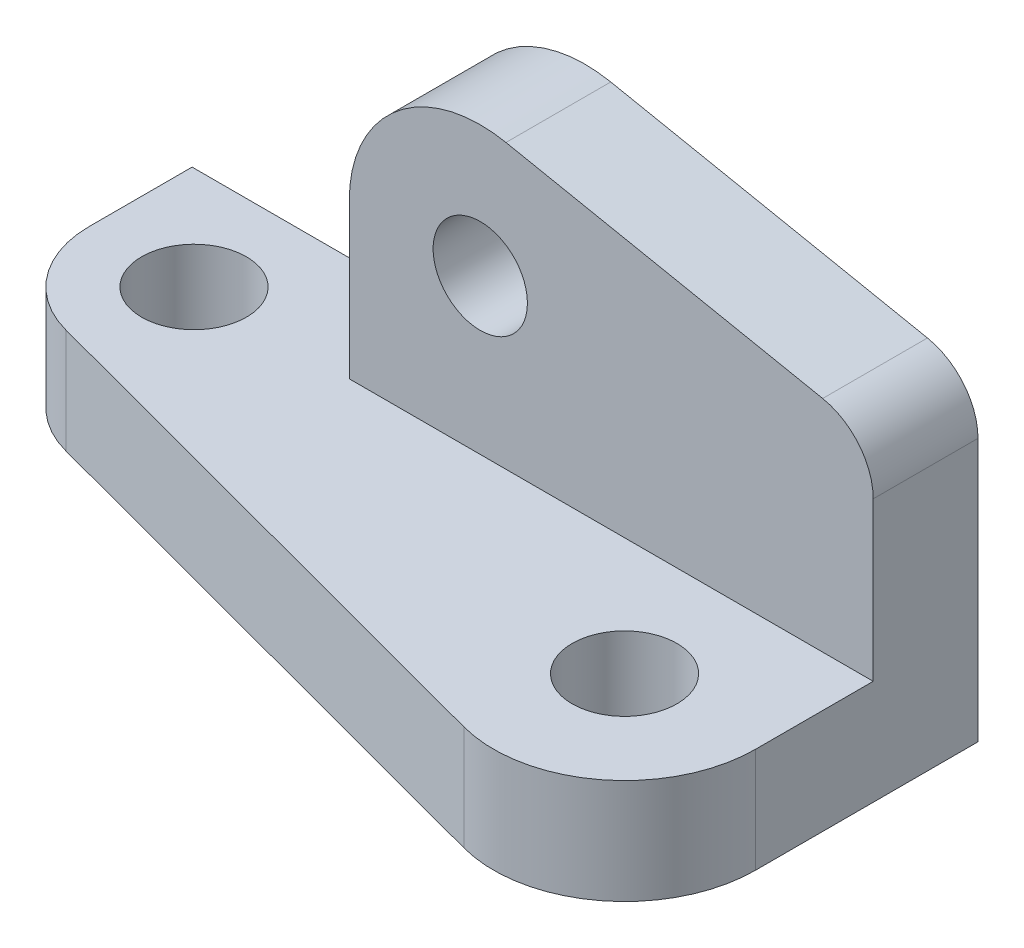
ISO-10303-21;
HEADER;
FILE_DESCRIPTION(('STEP AP214'),'2;1');
FILE_NAME('part.step','',(''),(''),'','','');
FILE_SCHEMA(('AUTOMOTIVE_DESIGN { 1 0 10303 214 1 1 1 1 }'));
ENDSEC;
DATA;
#1=APPLICATION_CONTEXT('core data for automotive mechanical design processes');
#2=APPLICATION_PROTOCOL_DEFINITION('international standard','automotive_design',2000,#1);
#3=PRODUCT_CONTEXT('',#1,'mechanical');
#4=PRODUCT('Part','Part','',(#3));
#5=PRODUCT_RELATED_PRODUCT_CATEGORY('part','',(#4));
#6=PRODUCT_DEFINITION_FORMATION('','',#4);
#7=PRODUCT_DEFINITION_CONTEXT('part definition',#1,'design');
#8=PRODUCT_DEFINITION('design','',#6,#7);
#9=PRODUCT_DEFINITION_SHAPE('','',#8);
#10=(LENGTH_UNIT() NAMED_UNIT(*) SI_UNIT(.MILLI.,.METRE.));
#11=(NAMED_UNIT(*) PLANE_ANGLE_UNIT() SI_UNIT($,.RADIAN.));
#12=(NAMED_UNIT(*) SI_UNIT($,.STERADIAN.) SOLID_ANGLE_UNIT());
#13=UNCERTAINTY_MEASURE_WITH_UNIT(LENGTH_MEASURE(1.E-05),#10,'distance_accuracy_value','');
#14=(GEOMETRIC_REPRESENTATION_CONTEXT(3) GLOBAL_UNCERTAINTY_ASSIGNED_CONTEXT((#13)) GLOBAL_UNIT_ASSIGNED_CONTEXT((#10,
#11,#12)) REPRESENTATION_CONTEXT('',''));
#15=CARTESIAN_POINT('',(0.,0.,0.));
#16=DIRECTION('',(0.,0.,1.));
#17=DIRECTION('',(1.,0.,0.));
#18=AXIS2_PLACEMENT_3D('',#15,#16,#17);
#19=CARTESIAN_POINT('',(150.,20.,40.));
#20=DIRECTION('',(0.257662650560332,0.,-0.966234939601246));
#21=DIRECTION('',(-0.966234939601246,0.,-0.257662650560332));
#22=AXIS2_PLACEMENT_3D('',#19,#20,#21);
#23=PLANE('',#22);
#24=DIRECTION('',(0.966234939601246,0.,0.257662650560332));
#25=VECTOR('',#24,1.);
#26=CARTESIAN_POINT('',(150.,0.,40.));
#27=LINE('',#26,#25);
#28=CARTESIAN_POINT('',(14.8467469887934,0.,3.9591325303449));
#29=VERTEX_POINT('',#28);
#30=CARTESIAN_POINT('',(118.558433735992,0.,31.6155823295978));
#31=VERTEX_POINT('',#30);
#32=EDGE_CURVE('E136',#29,#31,#27,.T.);
#33=ORIENTED_EDGE('',*,*,#32,.T.);
#34=DIRECTION('',(0.,-1.,0.));
#35=VECTOR('',#34,1.);
#36=CARTESIAN_POINT('',(118.558433735992,20.,31.6155823295978));
#37=LINE('',#36,#35);
#38=CARTESIAN_POINT('',(118.558433735992,20.,31.6155823295978));
#39=VERTEX_POINT('',#38);
#40=EDGE_CURVE('E186',#31,#39,#37,.F.);
#41=ORIENTED_EDGE('',*,*,#40,.T.);
#42=DIRECTION('',(0.966234939601246,0.,0.257662650560332));
#43=VECTOR('',#42,1.);
#44=CARTESIAN_POINT('',(150.,20.,40.));
#45=LINE('',#44,#43);
#46=CARTESIAN_POINT('',(14.8467469887934,20.,3.9591325303449));
#47=VERTEX_POINT('',#46);
#48=EDGE_CURVE('E155',#47,#39,#45,.T.);
#49=ORIENTED_EDGE('',*,*,#48,.F.);
#50=DIRECTION('',(0.,-1.,0.));
#51=VECTOR('',#50,1.);
#52=CARTESIAN_POINT('',(14.8467469887933,20.,3.95913253034489));
#53=LINE('',#52,#51);
#54=EDGE_CURVE('E172',#47,#29,#53,.T.);
#55=ORIENTED_EDGE('',*,*,#54,.T.);
#56=EDGE_LOOP('',(#33,#41,#49,#55));
#57=FACE_BOUND('',#56,.T.);
#58=ADVANCED_FACE('F33',(#57),#23,.F.);
#59=CARTESIAN_POINT('',(150.,20.,-35.));
#60=DIRECTION('',(-1.,0.,0.));
#61=DIRECTION('',(0.,0.,1.));
#62=AXIS2_PLACEMENT_3D('',#59,#60,#61);
#63=PLANE('',#62);
#64=DIRECTION('',(0.,-1.,0.));
#65=VECTOR('',#64,1.);
#66=CARTESIAN_POINT('',(150.,20.,-35.));
#67=LINE('',#66,#65);
#68=CARTESIAN_POINT('',(150.,50.1623531673773,-35.));
#69=VERTEX_POINT('',#68);
#70=CARTESIAN_POINT('',(150.,0.,-35.));
#71=VERTEX_POINT('',#70);
#72=EDGE_CURVE('E170',#69,#71,#67,.T.);
#73=ORIENTED_EDGE('',*,*,#72,.F.);
#74=DIRECTION('',(0.,0.,-1.));
#75=VECTOR('',#74,1.);
#76=CARTESIAN_POINT('',(150.,50.1623531673773,-15.));
#77=LINE('',#76,#75);
#78=CARTESIAN_POINT('',(150.,50.1623531673773,-15.));
#79=VERTEX_POINT('',#78);
#80=EDGE_CURVE('E41',#69,#79,#77,.F.);
#81=ORIENTED_EDGE('',*,*,#80,.T.);
#82=DIRECTION('',(0.,-1.,0.));
#83=VECTOR('',#82,1.);
#84=CARTESIAN_POINT('',(150.,0.,-15.));
#85=LINE('',#84,#83);
#86=CARTESIAN_POINT('',(150.,20.,-15.));
#87=VERTEX_POINT('',#86);
#88=EDGE_CURVE('E151',#79,#87,#85,.T.);
#89=ORIENTED_EDGE('',*,*,#88,.T.);
#90=DIRECTION('',(0.,0.,-1.));
#91=VECTOR('',#90,1.);
#92=CARTESIAN_POINT('',(150.,20.,-35.));
#93=LINE('',#92,#91);
#94=CARTESIAN_POINT('',(150.,20.,7.45970883956661));
#95=VERTEX_POINT('',#94);
#96=EDGE_CURVE('E124',#95,#87,#93,.T.);
#97=ORIENTED_EDGE('',*,*,#96,.F.);
#98=DIRECTION('',(0.,-1.,0.));
#99=VECTOR('',#98,1.);
#100=CARTESIAN_POINT('',(150.,20.,7.45970883956661));
#101=LINE('',#100,#99);
#102=CARTESIAN_POINT('',(150.,0.,7.45970883956661));
#103=VERTEX_POINT('',#102);
#104=EDGE_CURVE('E181',#95,#103,#101,.T.);
#105=ORIENTED_EDGE('',*,*,#104,.T.);
#106=DIRECTION('',(0.,0.,-1.));
#107=VECTOR('',#106,1.);
#108=CARTESIAN_POINT('',(150.,0.,-35.));
#109=LINE('',#108,#107);
#110=EDGE_CURVE('E162',#103,#71,#109,.T.);
#111=ORIENTED_EDGE('',*,*,#110,.T.);
#112=EDGE_LOOP('',(#73,#81,#89,#97,#105,#111));
#113=FACE_BOUND('',#112,.T.);
#114=ADVANCED_FACE('F246',(#113),#63,.F.);
#115=CARTESIAN_POINT('',(0.,20.,-35.));
#116=DIRECTION('',(0.,0.,1.));
#117=DIRECTION('',(1.,0.,0.));
#118=AXIS2_PLACEMENT_3D('',#115,#116,#117);
#119=PLANE('',#118);
#120=CARTESIAN_POINT('',(75.,49.5049024320361,-35.));
#121=DIRECTION('',(0.,0.,1.));
#122=DIRECTION('',(1.,0.,0.));
#123=AXIS2_PLACEMENT_3D('',#120,#121,#122);
#124=CIRCLE('',#123,8.99999999999999);
#125=CARTESIAN_POINT('',(84.,49.5049024320361,-35.));
#126=VERTEX_POINT('',#125);
#127=EDGE_CURVE('E225',#126,#126,#124,.T.);
#128=ORIENTED_EDGE('',*,*,#127,.T.);
#129=EDGE_LOOP('',(#128));
#130=FACE_BOUND('',#129,.T.);
#131=DIRECTION('',(0.98058067569092,-0.196116135138184,0.));
#132=VECTOR('',#131,1.);
#133=CARTESIAN_POINT('',(150.,60.,-35.));
#134=LINE('',#133,#132);
#135=CARTESIAN_POINT('',(79.9029033784546,74.0194193243091,-35.));
#136=VERTEX_POINT('',#135);
#137=CARTESIAN_POINT('',(140.353393621658,61.9293212756684,-35.));
#138=VERTEX_POINT('',#137);
#139=EDGE_CURVE('E142',#136,#138,#134,.T.);
#140=ORIENTED_EDGE('',*,*,#139,.T.);
#141=CARTESIAN_POINT('',(138.,50.1623531673773,-35.));
#142=DIRECTION('',(0.,0.,1.));
#143=DIRECTION('',(1.,0.,0.));
#144=AXIS2_PLACEMENT_3D('',#141,#142,#143);
#145=CIRCLE('',#144,12.);
#146=EDGE_CURVE('E55',#138,#69,#145,.F.);
#147=ORIENTED_EDGE('',*,*,#146,.T.);
#148=ORIENTED_EDGE('',*,*,#72,.T.);
#149=DIRECTION('',(-1.,0.,0.));
#150=VECTOR('',#149,1.);
#151=CARTESIAN_POINT('',(0.,0.,-35.));
#152=LINE('',#151,#150);
#153=CARTESIAN_POINT('',(0.,0.,-35.));
#154=VERTEX_POINT('',#153);
#155=EDGE_CURVE('E165',#71,#154,#152,.T.);
#156=ORIENTED_EDGE('',*,*,#155,.T.);
#157=DIRECTION('',(0.,-1.,0.));
#158=VECTOR('',#157,1.);
#159=CARTESIAN_POINT('',(0.,20.,-35.));
#160=LINE('',#159,#158);
#161=CARTESIAN_POINT('',(0.,20.,-35.));
#162=VERTEX_POINT('',#161);
#163=EDGE_CURVE('E119',#162,#154,#160,.T.);
#164=ORIENTED_EDGE('',*,*,#163,.F.);
#165=DIRECTION('',(-1.,0.,0.));
#166=VECTOR('',#165,1.);
#167=CARTESIAN_POINT('',(0.,20.,-35.));
#168=LINE('',#167,#166);
#169=CARTESIAN_POINT('',(50.,20.,-35.));
#170=VERTEX_POINT('',#169);
#171=EDGE_CURVE('E113',#170,#162,#168,.T.);
#172=ORIENTED_EDGE('',*,*,#171,.F.);
#173=DIRECTION('',(0.,1.,0.));
#174=VECTOR('',#173,1.);
#175=CARTESIAN_POINT('',(50.,80.,-35.));
#176=LINE('',#175,#174);
#177=CARTESIAN_POINT('',(50.,49.5049024320361,-35.));
#178=VERTEX_POINT('',#177);
#179=EDGE_CURVE('E117',#170,#178,#176,.T.);
#180=ORIENTED_EDGE('',*,*,#179,.T.);
#181=CARTESIAN_POINT('',(75.,49.5049024320361,-35.));
#182=DIRECTION('',(0.,0.,1.));
#183=DIRECTION('',(1.,0.,0.));
#184=AXIS2_PLACEMENT_3D('',#181,#182,#183);
#185=CIRCLE('',#184,25.);
#186=EDGE_CURVE('E191',#178,#136,#185,.F.);
#187=ORIENTED_EDGE('',*,*,#186,.T.);
#188=EDGE_LOOP('',(#140,#147,#148,#156,#164,#172,#180,#187));
#189=FACE_BOUND('',#188,.T.);
#190=ADVANCED_FACE('F115',(#130,#189),#119,.F.);
#191=CARTESIAN_POINT('',(0.,20.,0.));
#192=DIRECTION('',(1.,0.,0.));
#193=DIRECTION('',(0.,0.,-1.));
#194=AXIS2_PLACEMENT_3D('',#191,#192,#193);
#195=PLANE('',#194);
#196=DIRECTION('',(0.,0.,1.));
#197=VECTOR('',#196,1.);
#198=CARTESIAN_POINT('',(0.,0.,0.));
#199=LINE('',#198,#197);
#200=CARTESIAN_POINT('',(0.,0.,-15.36556626168));
#201=VERTEX_POINT('',#200);
#202=EDGE_CURVE('E157',#154,#201,#199,.T.);
#203=ORIENTED_EDGE('',*,*,#202,.T.);
#204=DIRECTION('',(0.,-1.,0.));
#205=VECTOR('',#204,1.);
#206=CARTESIAN_POINT('',(0.,20.,-15.36556626168));
#207=LINE('',#206,#205);
#208=CARTESIAN_POINT('',(0.,20.,-15.36556626168));
#209=VERTEX_POINT('',#208);
#210=EDGE_CURVE('E177',#201,#209,#207,.F.);
#211=ORIENTED_EDGE('',*,*,#210,.T.);
#212=DIRECTION('',(0.,0.,1.));
#213=VECTOR('',#212,1.);
#214=CARTESIAN_POINT('',(0.,20.,0.));
#215=LINE('',#214,#213);
#216=EDGE_CURVE('E123',#162,#209,#215,.T.);
#217=ORIENTED_EDGE('',*,*,#216,.F.);
#218=ORIENTED_EDGE('',*,*,#163,.T.);
#219=EDGE_LOOP('',(#203,#211,#217,#218));
#220=FACE_BOUND('',#219,.T.);
#221=ADVANCED_FACE('F286',(#220),#195,.F.);
#222=CARTESIAN_POINT('',(0.,20.,0.));
#223=DIRECTION('',(0.,-1.,0.));
#224=DIRECTION('',(0.,0.,-1.));
#225=AXIS2_PLACEMENT_3D('',#222,#223,#224);
#226=PLANE('',#225);
#227=CARTESIAN_POINT('',(20.,20.,-15.36556626168));
#228=DIRECTION('',(0.,1.,0.));
#229=DIRECTION('',(0.,0.,1.));
#230=AXIS2_PLACEMENT_3D('',#227,#228,#229);
#231=CIRCLE('',#230,9.99999999999999);
#232=CARTESIAN_POINT('',(20.,20.,-5.36556626168005));
#233=VERTEX_POINT('',#232);
#234=EDGE_CURVE('E222',#233,#233,#231,.T.);
#235=ORIENTED_EDGE('',*,*,#234,.F.);
#236=EDGE_LOOP('',(#235));
#237=FACE_BOUND('',#236,.T.);
#238=CARTESIAN_POINT('',(125.,20.,7.45970883956661));
#239=DIRECTION('',(0.,1.,0.));
#240=DIRECTION('',(0.,0.,1.));
#241=AXIS2_PLACEMENT_3D('',#238,#239,#240);
#242=CIRCLE('',#241,9.99999999999998);
#243=CARTESIAN_POINT('',(125.,20.,17.4597088395666));
#244=VERTEX_POINT('',#243);
#245=EDGE_CURVE('E148',#244,#244,#242,.T.);
#246=ORIENTED_EDGE('',*,*,#245,.F.);
#247=EDGE_LOOP('',(#246));
#248=FACE_BOUND('',#247,.T.);
#249=ORIENTED_EDGE('',*,*,#48,.T.);
#250=CARTESIAN_POINT('',(125.,20.,7.45970883956661));
#251=DIRECTION('',(0.,-1.,0.));
#252=DIRECTION('',(0.,0.,-1.));
#253=AXIS2_PLACEMENT_3D('',#250,#251,#252);
#254=CIRCLE('',#253,25.);
#255=EDGE_CURVE('E188',#39,#95,#254,.F.);
#256=ORIENTED_EDGE('',*,*,#255,.T.);
#257=ORIENTED_EDGE('',*,*,#96,.T.);
#258=DIRECTION('',(-1.,0.,0.));
#259=VECTOR('',#258,1.);
#260=CARTESIAN_POINT('',(0.,20.,-15.));
#261=LINE('',#260,#259);
#262=CARTESIAN_POINT('',(50.,20.,-15.));
#263=VERTEX_POINT('',#262);
#264=EDGE_CURVE('E132',#87,#263,#261,.T.);
#265=ORIENTED_EDGE('',*,*,#264,.T.);
#266=DIRECTION('',(0.,0.,-1.));
#267=VECTOR('',#266,1.);
#268=CARTESIAN_POINT('',(50.,20.,0.));
#269=LINE('',#268,#267);
#270=EDGE_CURVE('E127',#263,#170,#269,.T.);
#271=ORIENTED_EDGE('',*,*,#270,.T.);
#272=ORIENTED_EDGE('',*,*,#171,.T.);
#273=ORIENTED_EDGE('',*,*,#216,.T.);
#274=CARTESIAN_POINT('',(20.,20.,-15.36556626168));
#275=DIRECTION('',(0.,-1.,0.));
#276=DIRECTION('',(0.,0.,-1.));
#277=AXIS2_PLACEMENT_3D('',#274,#275,#276);
#278=CIRCLE('',#277,20.);
#279=EDGE_CURVE('E179',#209,#47,#278,.F.);
#280=ORIENTED_EDGE('',*,*,#279,.T.);
#281=EDGE_LOOP('',(#249,#256,#257,#265,#271,#272,#273,#280));
#282=FACE_BOUND('',#281,.T.);
#283=ADVANCED_FACE('F129',(#237,#248,#282),#226,.F.);
#284=CARTESIAN_POINT('',(0.,0.,0.));
#285=DIRECTION('',(0.,-1.,0.));
#286=DIRECTION('',(0.,0.,-1.));
#287=AXIS2_PLACEMENT_3D('',#284,#285,#286);
#288=PLANE('',#287);
#289=CARTESIAN_POINT('',(20.,0.,-15.36556626168));
#290=DIRECTION('',(0.,1.,0.));
#291=DIRECTION('',(0.,0.,1.));
#292=AXIS2_PLACEMENT_3D('',#289,#290,#291);
#293=CIRCLE('',#292,10.);
#294=CARTESIAN_POINT('',(20.,0.,-5.36556626168004));
#295=VERTEX_POINT('',#294);
#296=EDGE_CURVE('E219',#295,#295,#293,.T.);
#297=ORIENTED_EDGE('',*,*,#296,.T.);
#298=EDGE_LOOP('',(#297));
#299=FACE_BOUND('',#298,.T.);
#300=CARTESIAN_POINT('',(125.,0.,7.45970883956661));
#301=DIRECTION('',(0.,1.,0.));
#302=DIRECTION('',(0.,0.,1.));
#303=AXIS2_PLACEMENT_3D('',#300,#301,#302);
#304=CIRCLE('',#303,10.);
#305=CARTESIAN_POINT('',(125.,0.,17.4597088395666));
#306=VERTEX_POINT('',#305);
#307=EDGE_CURVE('E143',#306,#306,#304,.T.);
#308=ORIENTED_EDGE('',*,*,#307,.T.);
#309=EDGE_LOOP('',(#308));
#310=FACE_BOUND('',#309,.T.);
#311=ORIENTED_EDGE('',*,*,#110,.F.);
#312=CARTESIAN_POINT('',(125.,0.,7.45970883956661));
#313=DIRECTION('',(0.,-1.,0.));
#314=DIRECTION('',(0.,0.,-1.));
#315=AXIS2_PLACEMENT_3D('',#312,#313,#314);
#316=CIRCLE('',#315,25.);
#317=EDGE_CURVE('E184',#103,#31,#316,.T.);
#318=ORIENTED_EDGE('',*,*,#317,.T.);
#319=ORIENTED_EDGE('',*,*,#32,.F.);
#320=CARTESIAN_POINT('',(20.,0.,-15.36556626168));
#321=DIRECTION('',(0.,-1.,0.));
#322=DIRECTION('',(0.,0.,-1.));
#323=AXIS2_PLACEMENT_3D('',#320,#321,#322);
#324=CIRCLE('',#323,20.);
#325=EDGE_CURVE('E175',#29,#201,#324,.T.);
#326=ORIENTED_EDGE('',*,*,#325,.T.);
#327=ORIENTED_EDGE('',*,*,#202,.F.);
#328=ORIENTED_EDGE('',*,*,#155,.F.);
#329=EDGE_LOOP('',(#311,#318,#319,#326,#327,#328));
#330=FACE_BOUND('',#329,.T.);
#331=ADVANCED_FACE('F242',(#299,#310,#330),#288,.T.);
#332=CARTESIAN_POINT('',(50.,80.,-15.));
#333=DIRECTION('',(-1.,0.,0.));
#334=DIRECTION('',(0.,-1.,0.));
#335=AXIS2_PLACEMENT_3D('',#332,#333,#334);
#336=PLANE('',#335);
#337=DIRECTION('',(0.,1.,0.));
#338=VECTOR('',#337,1.);
#339=CARTESIAN_POINT('',(50.,80.,-15.));
#340=LINE('',#339,#338);
#341=CARTESIAN_POINT('',(50.,49.5049024320361,-15.));
#342=VERTEX_POINT('',#341);
#343=EDGE_CURVE('E145',#263,#342,#340,.T.);
#344=ORIENTED_EDGE('',*,*,#343,.T.);
#345=DIRECTION('',(0.,0.,-1.));
#346=VECTOR('',#345,1.);
#347=CARTESIAN_POINT('',(50.,49.5049024320361,-15.));
#348=LINE('',#347,#346);
#349=EDGE_CURVE('E141',#342,#178,#348,.T.);
#350=ORIENTED_EDGE('',*,*,#349,.T.);
#351=ORIENTED_EDGE('',*,*,#179,.F.);
#352=ORIENTED_EDGE('',*,*,#270,.F.);
#353=EDGE_LOOP('',(#344,#350,#351,#352));
#354=FACE_BOUND('',#353,.T.);
#355=ADVANCED_FACE('F139',(#354),#336,.T.);
#356=CARTESIAN_POINT('',(0.,0.,-15.));
#357=DIRECTION('',(0.,0.,1.));
#358=DIRECTION('',(1.,0.,0.));
#359=AXIS2_PLACEMENT_3D('',#356,#357,#358);
#360=PLANE('',#359);
#361=CARTESIAN_POINT('',(75.,49.5049024320361,-15.));
#362=DIRECTION('',(0.,0.,1.));
#363=DIRECTION('',(1.,0.,0.));
#364=AXIS2_PLACEMENT_3D('',#361,#362,#363);
#365=CIRCLE('',#364,8.99999999999999);
#366=CARTESIAN_POINT('',(84.,49.5049024320361,-15.));
#367=VERTEX_POINT('',#366);
#368=EDGE_CURVE('E228',#367,#367,#365,.T.);
#369=ORIENTED_EDGE('',*,*,#368,.F.);
#370=EDGE_LOOP('',(#369));
#371=FACE_BOUND('',#370,.T.);
#372=ORIENTED_EDGE('',*,*,#88,.F.);
#373=CARTESIAN_POINT('',(138.,50.1623531673773,-15.));
#374=DIRECTION('',(0.,0.,1.));
#375=DIRECTION('',(1.,0.,0.));
#376=AXIS2_PLACEMENT_3D('',#373,#374,#375);
#377=CIRCLE('',#376,12.);
#378=CARTESIAN_POINT('',(140.353393621658,61.9293212756684,-15.));
#379=VERTEX_POINT('',#378);
#380=EDGE_CURVE('E11',#79,#379,#377,.T.);
#381=ORIENTED_EDGE('',*,*,#380,.T.);
#382=DIRECTION('',(0.98058067569092,-0.196116135138184,0.));
#383=VECTOR('',#382,1.);
#384=CARTESIAN_POINT('',(150.,60.,-15.));
#385=LINE('',#384,#383);
#386=CARTESIAN_POINT('',(79.9029033784546,74.0194193243091,-15.));
#387=VERTEX_POINT('',#386);
#388=EDGE_CURVE('E207',#387,#379,#385,.T.);
#389=ORIENTED_EDGE('',*,*,#388,.F.);
#390=CARTESIAN_POINT('',(75.,49.5049024320361,-15.));
#391=DIRECTION('',(0.,0.,1.));
#392=DIRECTION('',(1.,0.,0.));
#393=AXIS2_PLACEMENT_3D('',#390,#391,#392);
#394=CIRCLE('',#393,25.);
#395=EDGE_CURVE('E195',#387,#342,#394,.T.);
#396=ORIENTED_EDGE('',*,*,#395,.T.);
#397=ORIENTED_EDGE('',*,*,#343,.F.);
#398=ORIENTED_EDGE('',*,*,#264,.F.);
#399=EDGE_LOOP('',(#372,#381,#389,#396,#397,#398));
#400=FACE_BOUND('',#399,.T.);
#401=ADVANCED_FACE('F214',(#371,#400),#360,.T.);
#402=CARTESIAN_POINT('',(150.,60.,-15.));
#403=DIRECTION('',(0.196116135138184,0.98058067569092,0.));
#404=DIRECTION('',(-0.98058067569092,0.196116135138184,0.));
#405=AXIS2_PLACEMENT_3D('',#402,#403,#404);
#406=PLANE('',#405);
#407=ORIENTED_EDGE('',*,*,#388,.T.);
#408=DIRECTION('',(0.,0.,-1.));
#409=VECTOR('',#408,1.);
#410=CARTESIAN_POINT('',(140.353393621658,61.9293212756684,-35.));
#411=LINE('',#410,#409);
#412=EDGE_CURVE('E197',#379,#138,#411,.T.);
#413=ORIENTED_EDGE('',*,*,#412,.T.);
#414=ORIENTED_EDGE('',*,*,#139,.F.);
#415=DIRECTION('',(0.,0.,-1.));
#416=VECTOR('',#415,1.);
#417=CARTESIAN_POINT('',(79.9029033784546,74.0194193243091,-15.));
#418=LINE('',#417,#416);
#419=EDGE_CURVE('E193',#136,#387,#418,.F.);
#420=ORIENTED_EDGE('',*,*,#419,.T.);
#421=EDGE_LOOP('',(#407,#413,#414,#420));
#422=FACE_BOUND('',#421,.T.);
#423=ADVANCED_FACE('F204',(#422),#406,.T.);
#424=CARTESIAN_POINT('',(20.,20.,-15.36556626168));
#425=DIRECTION('',(0.,-1.,0.));
#426=DIRECTION('',(0.,0.,-1.));
#427=AXIS2_PLACEMENT_3D('',#424,#425,#426);
#428=CYLINDRICAL_SURFACE('',#427,20.);
#429=ORIENTED_EDGE('',*,*,#279,.F.);
#430=ORIENTED_EDGE('',*,*,#210,.F.);
#431=ORIENTED_EDGE('',*,*,#325,.F.);
#432=ORIENTED_EDGE('',*,*,#54,.F.);
#433=EDGE_LOOP('',(#429,#430,#431,#432));
#434=FACE_BOUND('',#433,.T.);
#435=ADVANCED_FACE('F240',(#434),#428,.T.);
#436=CARTESIAN_POINT('',(125.,20.,7.45970883956661));
#437=DIRECTION('',(0.,-1.,0.));
#438=DIRECTION('',(0.,0.,-1.));
#439=AXIS2_PLACEMENT_3D('',#436,#437,#438);
#440=CYLINDRICAL_SURFACE('',#439,25.);
#441=ORIENTED_EDGE('',*,*,#255,.F.);
#442=ORIENTED_EDGE('',*,*,#40,.F.);
#443=ORIENTED_EDGE('',*,*,#317,.F.);
#444=ORIENTED_EDGE('',*,*,#104,.F.);
#445=EDGE_LOOP('',(#441,#442,#443,#444));
#446=FACE_BOUND('',#445,.T.);
#447=ADVANCED_FACE('F257',(#446),#440,.T.);
#448=CARTESIAN_POINT('',(75.,49.5049024320361,-15.));
#449=DIRECTION('',(0.,0.,-1.));
#450=DIRECTION('',(-1.,0.,0.));
#451=AXIS2_PLACEMENT_3D('',#448,#449,#450);
#452=CYLINDRICAL_SURFACE('',#451,25.);
#453=ORIENTED_EDGE('',*,*,#395,.F.);
#454=ORIENTED_EDGE('',*,*,#419,.F.);
#455=ORIENTED_EDGE('',*,*,#186,.F.);
#456=ORIENTED_EDGE('',*,*,#349,.F.);
#457=EDGE_LOOP('',(#453,#454,#455,#456));
#458=FACE_BOUND('',#457,.T.);
#459=ADVANCED_FACE('F212',(#458),#452,.T.);
#460=CARTESIAN_POINT('',(138.,50.1623531673773,-15.));
#461=DIRECTION('',(0.,0.,1.));
#462=DIRECTION('',(1.,0.,0.));
#463=AXIS2_PLACEMENT_3D('',#460,#461,#462);
#464=CYLINDRICAL_SURFACE('',#463,12.);
#465=ORIENTED_EDGE('',*,*,#380,.F.);
#466=ORIENTED_EDGE('',*,*,#80,.F.);
#467=ORIENTED_EDGE('',*,*,#146,.F.);
#468=ORIENTED_EDGE('',*,*,#412,.F.);
#469=EDGE_LOOP('',(#465,#466,#467,#468));
#470=FACE_BOUND('',#469,.T.);
#471=ADVANCED_FACE('F35',(#470),#464,.T.);
#472=CARTESIAN_POINT('',(125.,20.,7.45970883956661));
#473=DIRECTION('',(0.,1.,0.));
#474=DIRECTION('',(0.,0.,1.));
#475=AXIS2_PLACEMENT_3D('',#472,#473,#474);
#476=CYLINDRICAL_SURFACE('',#475,9.99999999999999);
#477=ORIENTED_EDGE('',*,*,#307,.F.);
#478=EDGE_LOOP('',(#477));
#479=FACE_BOUND('',#478,.T.);
#480=ORIENTED_EDGE('',*,*,#245,.T.);
#481=EDGE_LOOP('',(#480));
#482=FACE_BOUND('',#481,.T.);
#483=ADVANCED_FACE('F265',(#479,#482),#476,.F.);
#484=CARTESIAN_POINT('',(20.,20.,-15.36556626168));
#485=DIRECTION('',(0.,1.,0.));
#486=DIRECTION('',(0.,0.,1.));
#487=AXIS2_PLACEMENT_3D('',#484,#485,#486);
#488=CYLINDRICAL_SURFACE('',#487,9.99999999999999);
#489=ORIENTED_EDGE('',*,*,#296,.F.);
#490=EDGE_LOOP('',(#489));
#491=FACE_BOUND('',#490,.T.);
#492=ORIENTED_EDGE('',*,*,#234,.T.);
#493=EDGE_LOOP('',(#492));
#494=FACE_BOUND('',#493,.T.);
#495=ADVANCED_FACE('F269',(#491,#494),#488,.F.);
#496=CARTESIAN_POINT('',(75.,49.5049024320361,-15.));
#497=DIRECTION('',(0.,0.,1.));
#498=DIRECTION('',(1.,0.,0.));
#499=AXIS2_PLACEMENT_3D('',#496,#497,#498);
#500=CYLINDRICAL_SURFACE('',#499,8.99999999999999);
#501=ORIENTED_EDGE('',*,*,#127,.F.);
#502=EDGE_LOOP('',(#501));
#503=FACE_BOUND('',#502,.T.);
#504=ORIENTED_EDGE('',*,*,#368,.T.);
#505=EDGE_LOOP('',(#504));
#506=FACE_BOUND('',#505,.T.);
#507=ADVANCED_FACE('F232',(#503,#506),#500,.F.);
#508=CLOSED_SHELL('',(#58,#114,#190,#221,#283,#331,#355,#401,#423,#435,#447,#459,#471,#483,#495,#507));
#509=MANIFOLD_SOLID_BREP('B2',#508);
#510=ADVANCED_BREP_SHAPE_REPRESENTATION('',(#18,#509),#14);
#511=SHAPE_DEFINITION_REPRESENTATION(#9,#510);
ENDSEC;
END-ISO-10303-21;
